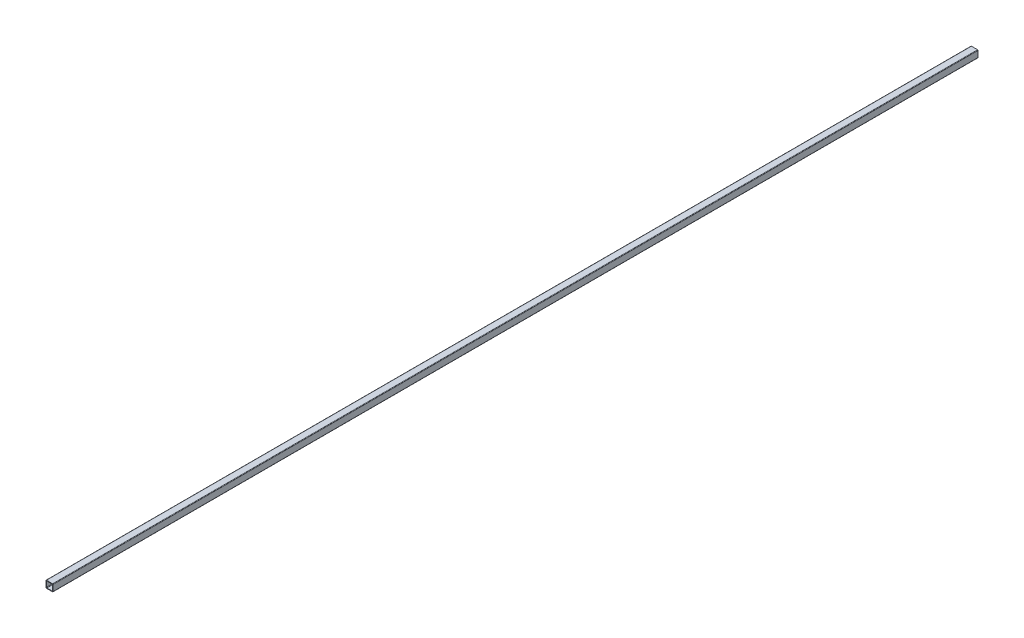
ISO-10303-21;
HEADER;
FILE_DESCRIPTION(('STEP AP214'),'2;1');
FILE_NAME('part.step','',(''),(''),'','','');
FILE_SCHEMA(('AUTOMOTIVE_DESIGN { 1 0 10303 214 1 1 1 1 }'));
ENDSEC;
DATA;
#1=APPLICATION_CONTEXT('core data for automotive mechanical design processes');
#2=APPLICATION_PROTOCOL_DEFINITION('international standard','automotive_design',2000,#1);
#3=PRODUCT_CONTEXT('',#1,'mechanical');
#4=PRODUCT('Part','Part','',(#3));
#5=PRODUCT_RELATED_PRODUCT_CATEGORY('part','',(#4));
#6=PRODUCT_DEFINITION_FORMATION('','',#4);
#7=PRODUCT_DEFINITION_CONTEXT('part definition',#1,'design');
#8=PRODUCT_DEFINITION('design','',#6,#7);
#9=PRODUCT_DEFINITION_SHAPE('','',#8);
#10=(LENGTH_UNIT() NAMED_UNIT(*) SI_UNIT(.MILLI.,.METRE.));
#11=(NAMED_UNIT(*) PLANE_ANGLE_UNIT() SI_UNIT($,.RADIAN.));
#12=(NAMED_UNIT(*) SI_UNIT($,.STERADIAN.) SOLID_ANGLE_UNIT());
#13=UNCERTAINTY_MEASURE_WITH_UNIT(LENGTH_MEASURE(1.E-05),#10,'distance_accuracy_value','');
#14=(GEOMETRIC_REPRESENTATION_CONTEXT(3) GLOBAL_UNCERTAINTY_ASSIGNED_CONTEXT((#13)) GLOBAL_UNIT_ASSIGNED_CONTEXT((#10,
#11,#12)) REPRESENTATION_CONTEXT('',''));
#15=CARTESIAN_POINT('',(0.,0.,0.));
#16=DIRECTION('',(0.,0.,1.));
#17=DIRECTION('',(1.,0.,0.));
#18=AXIS2_PLACEMENT_3D('',#15,#16,#17);
#19=CARTESIAN_POINT('',(2.54,-35.56,5020.));
#20=DIRECTION('',(0.,0.,1.));
#21=DIRECTION('',(1.,0.,0.));
#22=AXIS2_PLACEMENT_3D('',#19,#20,#21);
#23=PLANE('',#22);
#24=CARTESIAN_POINT('',(2.54,-35.56,5020.));
#25=DIRECTION('',(0.,0.,1.));
#26=DIRECTION('',(1.,0.,0.));
#27=AXIS2_PLACEMENT_3D('',#24,#25,#26);
#28=CIRCLE('',#27,2.54);
#29=CARTESIAN_POINT('',(0.,-35.56,5020.));
#30=VERTEX_POINT('',#29);
#31=CARTESIAN_POINT('',(2.54000000000002,-38.1,5020.));
#32=VERTEX_POINT('',#31);
#33=EDGE_CURVE('E212',#30,#32,#28,.T.);
#34=ORIENTED_EDGE('',*,*,#33,.T.);
#35=DIRECTION('',(1.,0.,0.));
#36=VECTOR('',#35,1.);
#37=CARTESIAN_POINT('',(2.54000000000002,-38.1,5020.));
#38=LINE('',#37,#36);
#39=CARTESIAN_POINT('',(35.56,-38.1,5020.));
#40=VERTEX_POINT('',#39);
#41=EDGE_CURVE('E215',#32,#40,#38,.T.);
#42=ORIENTED_EDGE('',*,*,#41,.T.);
#43=CARTESIAN_POINT('',(35.56,-35.56,5020.));
#44=DIRECTION('',(0.,0.,1.));
#45=DIRECTION('',(-1.,0.,0.));
#46=AXIS2_PLACEMENT_3D('',#43,#44,#45);
#47=CIRCLE('',#46,2.54);
#48=CARTESIAN_POINT('',(38.1,-35.56,5020.));
#49=VERTEX_POINT('',#48);
#50=EDGE_CURVE('E218',#40,#49,#47,.T.);
#51=ORIENTED_EDGE('',*,*,#50,.T.);
#52=DIRECTION('',(0.,1.,0.));
#53=VECTOR('',#52,1.);
#54=CARTESIAN_POINT('',(38.1,-2.54000000000002,5020.));
#55=LINE('',#54,#53);
#56=CARTESIAN_POINT('',(38.1,-2.54000000000002,5020.));
#57=VERTEX_POINT('',#56);
#58=EDGE_CURVE('E220',#49,#57,#55,.T.);
#59=ORIENTED_EDGE('',*,*,#58,.T.);
#60=CARTESIAN_POINT('',(35.56,-2.54,5020.));
#61=DIRECTION('',(0.,0.,1.));
#62=DIRECTION('',(1.,0.,0.));
#63=AXIS2_PLACEMENT_3D('',#60,#61,#62);
#64=CIRCLE('',#63,2.54);
#65=CARTESIAN_POINT('',(35.56,0.,5020.));
#66=VERTEX_POINT('',#65);
#67=EDGE_CURVE('E222',#57,#66,#64,.T.);
#68=ORIENTED_EDGE('',*,*,#67,.T.);
#69=DIRECTION('',(-1.,0.,0.));
#70=VECTOR('',#69,1.);
#71=CARTESIAN_POINT('',(2.54000000000002,0.,5020.));
#72=LINE('',#71,#70);
#73=CARTESIAN_POINT('',(2.54000000000002,0.,5020.));
#74=VERTEX_POINT('',#73);
#75=EDGE_CURVE('E224',#66,#74,#72,.T.);
#76=ORIENTED_EDGE('',*,*,#75,.T.);
#77=CARTESIAN_POINT('',(2.54,-2.54,5020.));
#78=DIRECTION('',(0.,0.,1.));
#79=DIRECTION('',(-1.,0.,0.));
#80=AXIS2_PLACEMENT_3D('',#77,#78,#79);
#81=CIRCLE('',#80,2.54);
#82=CARTESIAN_POINT('',(0.,-2.54000000000002,5020.));
#83=VERTEX_POINT('',#82);
#84=EDGE_CURVE('E226',#74,#83,#81,.T.);
#85=ORIENTED_EDGE('',*,*,#84,.T.);
#86=DIRECTION('',(0.,-1.,0.));
#87=VECTOR('',#86,1.);
#88=CARTESIAN_POINT('',(0.,-2.54000000000002,5020.));
#89=LINE('',#88,#87);
#90=EDGE_CURVE('E228',#83,#30,#89,.T.);
#91=ORIENTED_EDGE('',*,*,#90,.T.);
#92=EDGE_LOOP('',(#34,#42,#51,#59,#68,#76,#85,#91));
#93=FACE_BOUND('',#92,.T.);
#94=DIRECTION('',(1.,0.,0.));
#95=VECTOR('',#94,1.);
#96=CARTESIAN_POINT('',(5.30860000000002,-35.3314,5020.));
#97=LINE('',#96,#95);
#98=CARTESIAN_POINT('',(5.30860000000002,-35.3314,5020.));
#99=VERTEX_POINT('',#98);
#100=CARTESIAN_POINT('',(32.7914,-35.3314,5020.));
#101=VERTEX_POINT('',#100);
#102=EDGE_CURVE('E155',#99,#101,#97,.T.);
#103=ORIENTED_EDGE('',*,*,#102,.F.);
#104=CARTESIAN_POINT('',(5.3086,-32.7914,5020.));
#105=DIRECTION('',(0.,0.,1.));
#106=DIRECTION('',(1.,0.,0.));
#107=AXIS2_PLACEMENT_3D('',#104,#105,#106);
#108=CIRCLE('',#107,2.54);
#109=CARTESIAN_POINT('',(2.7686,-32.7914,5020.));
#110=VERTEX_POINT('',#109);
#111=EDGE_CURVE('E147',#110,#99,#108,.T.);
#112=ORIENTED_EDGE('',*,*,#111,.F.);
#113=DIRECTION('',(0.,-1.,0.));
#114=VECTOR('',#113,1.);
#115=CARTESIAN_POINT('',(2.7686,-5.30860000000002,5020.));
#116=LINE('',#115,#114);
#117=CARTESIAN_POINT('',(2.7686,-5.30860000000002,5020.));
#118=VERTEX_POINT('',#117);
#119=EDGE_CURVE('E180',#118,#110,#116,.T.);
#120=ORIENTED_EDGE('',*,*,#119,.F.);
#121=CARTESIAN_POINT('',(5.3086,-5.3086,5020.));
#122=DIRECTION('',(0.,0.,1.));
#123=DIRECTION('',(1.,0.,0.));
#124=AXIS2_PLACEMENT_3D('',#121,#122,#123);
#125=CIRCLE('',#124,2.54);
#126=CARTESIAN_POINT('',(5.30860000000002,-2.7686,5020.));
#127=VERTEX_POINT('',#126);
#128=EDGE_CURVE('E178',#127,#118,#125,.T.);
#129=ORIENTED_EDGE('',*,*,#128,.F.);
#130=DIRECTION('',(-1.,0.,0.));
#131=VECTOR('',#130,1.);
#132=CARTESIAN_POINT('',(5.30860000000002,-2.7686,5020.));
#133=LINE('',#132,#131);
#134=CARTESIAN_POINT('',(32.7914,-2.7686,5020.));
#135=VERTEX_POINT('',#134);
#136=EDGE_CURVE('E176',#135,#127,#133,.T.);
#137=ORIENTED_EDGE('',*,*,#136,.F.);
#138=CARTESIAN_POINT('',(32.7914,-5.3086,5020.));
#139=DIRECTION('',(0.,0.,1.));
#140=DIRECTION('',(1.,0.,0.));
#141=AXIS2_PLACEMENT_3D('',#138,#139,#140);
#142=CIRCLE('',#141,2.54);
#143=CARTESIAN_POINT('',(35.3314,-5.30860000000002,5020.));
#144=VERTEX_POINT('',#143);
#145=EDGE_CURVE('E174',#144,#135,#142,.T.);
#146=ORIENTED_EDGE('',*,*,#145,.F.);
#147=DIRECTION('',(0.,1.,0.));
#148=VECTOR('',#147,1.);
#149=CARTESIAN_POINT('',(35.3314,-5.30860000000002,5020.));
#150=LINE('',#149,#148);
#151=CARTESIAN_POINT('',(35.3314,-32.7914,5020.));
#152=VERTEX_POINT('',#151);
#153=EDGE_CURVE('E170',#152,#144,#150,.T.);
#154=ORIENTED_EDGE('',*,*,#153,.F.);
#155=CARTESIAN_POINT('',(32.7914,-32.7914,5020.));
#156=DIRECTION('',(0.,0.,1.));
#157=DIRECTION('',(1.,0.,0.));
#158=AXIS2_PLACEMENT_3D('',#155,#156,#157);
#159=CIRCLE('',#158,2.54);
#160=EDGE_CURVE('E168',#101,#152,#159,.T.);
#161=ORIENTED_EDGE('',*,*,#160,.F.);
#162=EDGE_LOOP('',(#103,#112,#120,#129,#137,#146,#154,#161));
#163=FACE_BOUND('',#162,.T.);
#164=ADVANCED_FACE('F34',(#93,#163),#23,.T.);
#165=CARTESIAN_POINT('',(2.54,-35.56,0.));
#166=DIRECTION('',(0.,0.,1.));
#167=DIRECTION('',(1.,0.,0.));
#168=AXIS2_PLACEMENT_3D('',#165,#166,#167);
#169=PLANE('',#168);
#170=CARTESIAN_POINT('',(2.54,-35.56,0.));
#171=DIRECTION('',(0.,0.,1.));
#172=DIRECTION('',(1.,0.,0.));
#173=AXIS2_PLACEMENT_3D('',#170,#171,#172);
#174=CIRCLE('',#173,2.54);
#175=CARTESIAN_POINT('',(0.,-35.56,0.));
#176=VERTEX_POINT('',#175);
#177=CARTESIAN_POINT('',(2.54000000000002,-38.1,0.));
#178=VERTEX_POINT('',#177);
#179=EDGE_CURVE('E163',#176,#178,#174,.T.);
#180=ORIENTED_EDGE('',*,*,#179,.F.);
#181=DIRECTION('',(0.,-1.,0.));
#182=VECTOR('',#181,1.);
#183=CARTESIAN_POINT('',(0.,-2.54000000000002,0.));
#184=LINE('',#183,#182);
#185=CARTESIAN_POINT('',(0.,-2.54000000000002,0.));
#186=VERTEX_POINT('',#185);
#187=EDGE_CURVE('E216',#186,#176,#184,.T.);
#188=ORIENTED_EDGE('',*,*,#187,.F.);
#189=CARTESIAN_POINT('',(2.54,-2.54,0.));
#190=DIRECTION('',(0.,0.,1.));
#191=DIRECTION('',(-1.,0.,0.));
#192=AXIS2_PLACEMENT_3D('',#189,#190,#191);
#193=CIRCLE('',#192,2.54);
#194=CARTESIAN_POINT('',(2.54000000000002,0.,0.));
#195=VERTEX_POINT('',#194);
#196=EDGE_CURVE('E243',#195,#186,#193,.T.);
#197=ORIENTED_EDGE('',*,*,#196,.F.);
#198=DIRECTION('',(-1.,0.,0.));
#199=VECTOR('',#198,1.);
#200=CARTESIAN_POINT('',(2.54000000000002,0.,0.));
#201=LINE('',#200,#199);
#202=CARTESIAN_POINT('',(35.56,0.,0.));
#203=VERTEX_POINT('',#202);
#204=EDGE_CURVE('E241',#203,#195,#201,.T.);
#205=ORIENTED_EDGE('',*,*,#204,.F.);
#206=CARTESIAN_POINT('',(35.56,-2.54,0.));
#207=DIRECTION('',(0.,0.,1.));
#208=DIRECTION('',(1.,0.,0.));
#209=AXIS2_PLACEMENT_3D('',#206,#207,#208);
#210=CIRCLE('',#209,2.54);
#211=CARTESIAN_POINT('',(38.1,-2.54000000000002,0.));
#212=VERTEX_POINT('',#211);
#213=EDGE_CURVE('E239',#212,#203,#210,.T.);
#214=ORIENTED_EDGE('',*,*,#213,.F.);
#215=DIRECTION('',(0.,1.,0.));
#216=VECTOR('',#215,1.);
#217=CARTESIAN_POINT('',(38.1,-2.54000000000002,0.));
#218=LINE('',#217,#216);
#219=CARTESIAN_POINT('',(38.1,-35.56,0.));
#220=VERTEX_POINT('',#219);
#221=EDGE_CURVE('E237',#220,#212,#218,.T.);
#222=ORIENTED_EDGE('',*,*,#221,.F.);
#223=CARTESIAN_POINT('',(35.56,-35.56,0.));
#224=DIRECTION('',(0.,0.,1.));
#225=DIRECTION('',(-1.,0.,0.));
#226=AXIS2_PLACEMENT_3D('',#223,#224,#225);
#227=CIRCLE('',#226,2.54);
#228=CARTESIAN_POINT('',(35.56,-38.1,0.));
#229=VERTEX_POINT('',#228);
#230=EDGE_CURVE('E235',#229,#220,#227,.T.);
#231=ORIENTED_EDGE('',*,*,#230,.F.);
#232=DIRECTION('',(1.,0.,0.));
#233=VECTOR('',#232,1.);
#234=CARTESIAN_POINT('',(2.54000000000002,-38.1,0.));
#235=LINE('',#234,#233);
#236=EDGE_CURVE('E233',#178,#229,#235,.T.);
#237=ORIENTED_EDGE('',*,*,#236,.F.);
#238=EDGE_LOOP('',(#180,#188,#197,#205,#214,#222,#231,#237));
#239=FACE_BOUND('',#238,.T.);
#240=CARTESIAN_POINT('',(5.3086,-32.7914,0.));
#241=DIRECTION('',(0.,0.,1.));
#242=DIRECTION('',(1.,0.,0.));
#243=AXIS2_PLACEMENT_3D('',#240,#241,#242);
#244=CIRCLE('',#243,2.54);
#245=CARTESIAN_POINT('',(2.7686,-32.7914,0.));
#246=VERTEX_POINT('',#245);
#247=CARTESIAN_POINT('',(5.30860000000002,-35.3314,0.));
#248=VERTEX_POINT('',#247);
#249=EDGE_CURVE('E57',#246,#248,#244,.T.);
#250=ORIENTED_EDGE('',*,*,#249,.T.);
#251=DIRECTION('',(1.,0.,0.));
#252=VECTOR('',#251,1.);
#253=CARTESIAN_POINT('',(5.30860000000002,-35.3314,0.));
#254=LINE('',#253,#252);
#255=CARTESIAN_POINT('',(32.7914,-35.3314,0.));
#256=VERTEX_POINT('',#255);
#257=EDGE_CURVE('E162',#248,#256,#254,.T.);
#258=ORIENTED_EDGE('',*,*,#257,.T.);
#259=CARTESIAN_POINT('',(32.7914,-32.7914,0.));
#260=DIRECTION('',(0.,0.,1.));
#261=DIRECTION('',(1.,0.,0.));
#262=AXIS2_PLACEMENT_3D('',#259,#260,#261);
#263=CIRCLE('',#262,2.54);
#264=CARTESIAN_POINT('',(35.3314,-32.7914,0.));
#265=VERTEX_POINT('',#264);
#266=EDGE_CURVE('E184',#256,#265,#263,.T.);
#267=ORIENTED_EDGE('',*,*,#266,.T.);
#268=DIRECTION('',(0.,1.,0.));
#269=VECTOR('',#268,1.);
#270=CARTESIAN_POINT('',(35.3314,-5.30860000000002,0.));
#271=LINE('',#270,#269);
#272=CARTESIAN_POINT('',(35.3314,-5.30860000000002,0.));
#273=VERTEX_POINT('',#272);
#274=EDGE_CURVE('E187',#265,#273,#271,.T.);
#275=ORIENTED_EDGE('',*,*,#274,.T.);
#276=CARTESIAN_POINT('',(32.7914,-5.3086,0.));
#277=DIRECTION('',(0.,0.,1.));
#278=DIRECTION('',(1.,0.,0.));
#279=AXIS2_PLACEMENT_3D('',#276,#277,#278);
#280=CIRCLE('',#279,2.54);
#281=CARTESIAN_POINT('',(32.7914,-2.7686,0.));
#282=VERTEX_POINT('',#281);
#283=EDGE_CURVE('E190',#273,#282,#280,.T.);
#284=ORIENTED_EDGE('',*,*,#283,.T.);
#285=DIRECTION('',(-1.,0.,0.));
#286=VECTOR('',#285,1.);
#287=CARTESIAN_POINT('',(5.30860000000002,-2.7686,0.));
#288=LINE('',#287,#286);
#289=CARTESIAN_POINT('',(5.30860000000002,-2.7686,0.));
#290=VERTEX_POINT('',#289);
#291=EDGE_CURVE('E193',#282,#290,#288,.T.);
#292=ORIENTED_EDGE('',*,*,#291,.T.);
#293=CARTESIAN_POINT('',(5.3086,-5.3086,0.));
#294=DIRECTION('',(0.,0.,1.));
#295=DIRECTION('',(1.,0.,0.));
#296=AXIS2_PLACEMENT_3D('',#293,#294,#295);
#297=CIRCLE('',#296,2.54);
#298=CARTESIAN_POINT('',(2.7686,-5.30860000000002,0.));
#299=VERTEX_POINT('',#298);
#300=EDGE_CURVE('E196',#290,#299,#297,.T.);
#301=ORIENTED_EDGE('',*,*,#300,.T.);
#302=DIRECTION('',(0.,-1.,0.));
#303=VECTOR('',#302,1.);
#304=CARTESIAN_POINT('',(2.7686,-5.30860000000002,0.));
#305=LINE('',#304,#303);
#306=EDGE_CURVE('E156',#299,#246,#305,.T.);
#307=ORIENTED_EDGE('',*,*,#306,.T.);
#308=EDGE_LOOP('',(#250,#258,#267,#275,#284,#292,#301,#307));
#309=FACE_BOUND('',#308,.T.);
#310=ADVANCED_FACE('F273',(#239,#309),#169,.F.);
#311=CARTESIAN_POINT('',(2.54,-35.56,5020.));
#312=DIRECTION('',(0.,0.,-1.));
#313=DIRECTION('',(-1.,0.,0.));
#314=AXIS2_PLACEMENT_3D('',#311,#312,#313);
#315=CYLINDRICAL_SURFACE('',#314,2.54);
#316=ORIENTED_EDGE('',*,*,#179,.T.);
#317=DIRECTION('',(0.,0.,-1.));
#318=VECTOR('',#317,1.);
#319=CARTESIAN_POINT('',(2.54000000000002,-38.1,5020.));
#320=LINE('',#319,#318);
#321=EDGE_CURVE('E11',#32,#178,#320,.T.);
#322=ORIENTED_EDGE('',*,*,#321,.F.);
#323=ORIENTED_EDGE('',*,*,#33,.F.);
#324=DIRECTION('',(0.,0.,-1.));
#325=VECTOR('',#324,1.);
#326=CARTESIAN_POINT('',(0.,-35.56,5020.));
#327=LINE('',#326,#325);
#328=EDGE_CURVE('E230',#30,#176,#327,.T.);
#329=ORIENTED_EDGE('',*,*,#328,.T.);
#330=EDGE_LOOP('',(#316,#322,#323,#329));
#331=FACE_BOUND('',#330,.T.);
#332=ADVANCED_FACE('F36',(#331),#315,.T.);
#333=CARTESIAN_POINT('',(2.54000000000002,-38.1,5020.));
#334=DIRECTION('',(0.,1.,0.));
#335=DIRECTION('',(0.,0.,1.));
#336=AXIS2_PLACEMENT_3D('',#333,#334,#335);
#337=PLANE('',#336);
#338=ORIENTED_EDGE('',*,*,#236,.T.);
#339=DIRECTION('',(0.,0.,-1.));
#340=VECTOR('',#339,1.);
#341=CARTESIAN_POINT('',(35.56,-38.1,5020.));
#342=LINE('',#341,#340);
#343=EDGE_CURVE('E42',#40,#229,#342,.T.);
#344=ORIENTED_EDGE('',*,*,#343,.F.);
#345=ORIENTED_EDGE('',*,*,#41,.F.);
#346=ORIENTED_EDGE('',*,*,#321,.T.);
#347=EDGE_LOOP('',(#338,#344,#345,#346));
#348=FACE_BOUND('',#347,.T.);
#349=ADVANCED_FACE('F290',(#348),#337,.F.);
#350=CARTESIAN_POINT('',(35.56,-35.56,5020.));
#351=DIRECTION('',(0.,0.,-1.));
#352=DIRECTION('',(-1.,0.,0.));
#353=AXIS2_PLACEMENT_3D('',#350,#351,#352);
#354=CYLINDRICAL_SURFACE('',#353,2.54);
#355=ORIENTED_EDGE('',*,*,#230,.T.);
#356=DIRECTION('',(0.,0.,-1.));
#357=VECTOR('',#356,1.);
#358=CARTESIAN_POINT('',(38.1,-35.56,5020.));
#359=LINE('',#358,#357);
#360=EDGE_CURVE('E260',#49,#220,#359,.T.);
#361=ORIENTED_EDGE('',*,*,#360,.F.);
#362=ORIENTED_EDGE('',*,*,#50,.F.);
#363=ORIENTED_EDGE('',*,*,#343,.T.);
#364=EDGE_LOOP('',(#355,#361,#362,#363));
#365=FACE_BOUND('',#364,.T.);
#366=ADVANCED_FACE('F267',(#365),#354,.T.);
#367=CARTESIAN_POINT('',(38.1,-2.54000000000002,5020.));
#368=DIRECTION('',(-1.,0.,0.));
#369=DIRECTION('',(0.,-1.,0.));
#370=AXIS2_PLACEMENT_3D('',#367,#368,#369);
#371=PLANE('',#370);
#372=ORIENTED_EDGE('',*,*,#221,.T.);
#373=DIRECTION('',(0.,0.,-1.));
#374=VECTOR('',#373,1.);
#375=CARTESIAN_POINT('',(38.1,-2.54000000000002,5020.));
#376=LINE('',#375,#374);
#377=EDGE_CURVE('E257',#57,#212,#376,.T.);
#378=ORIENTED_EDGE('',*,*,#377,.F.);
#379=ORIENTED_EDGE('',*,*,#58,.F.);
#380=ORIENTED_EDGE('',*,*,#360,.T.);
#381=EDGE_LOOP('',(#372,#378,#379,#380));
#382=FACE_BOUND('',#381,.T.);
#383=ADVANCED_FACE('F279',(#382),#371,.F.);
#384=CARTESIAN_POINT('',(35.56,-2.54,5020.));
#385=DIRECTION('',(0.,0.,-1.));
#386=DIRECTION('',(-1.,0.,0.));
#387=AXIS2_PLACEMENT_3D('',#384,#385,#386);
#388=CYLINDRICAL_SURFACE('',#387,2.54);
#389=ORIENTED_EDGE('',*,*,#213,.T.);
#390=DIRECTION('',(0.,0.,-1.));
#391=VECTOR('',#390,1.);
#392=CARTESIAN_POINT('',(35.56,0.,5020.));
#393=LINE('',#392,#391);
#394=EDGE_CURVE('E254',#66,#203,#393,.T.);
#395=ORIENTED_EDGE('',*,*,#394,.F.);
#396=ORIENTED_EDGE('',*,*,#67,.F.);
#397=ORIENTED_EDGE('',*,*,#377,.T.);
#398=EDGE_LOOP('',(#389,#395,#396,#397));
#399=FACE_BOUND('',#398,.T.);
#400=ADVANCED_FACE('F283',(#399),#388,.T.);
#401=CARTESIAN_POINT('',(2.54000000000002,0.,5020.));
#402=DIRECTION('',(0.,-1.,0.));
#403=DIRECTION('',(0.,0.,-1.));
#404=AXIS2_PLACEMENT_3D('',#401,#402,#403);
#405=PLANE('',#404);
#406=ORIENTED_EDGE('',*,*,#204,.T.);
#407=DIRECTION('',(0.,0.,-1.));
#408=VECTOR('',#407,1.);
#409=CARTESIAN_POINT('',(2.54000000000002,0.,5020.));
#410=LINE('',#409,#408);
#411=EDGE_CURVE('E251',#74,#195,#410,.T.);
#412=ORIENTED_EDGE('',*,*,#411,.F.);
#413=ORIENTED_EDGE('',*,*,#75,.F.);
#414=ORIENTED_EDGE('',*,*,#394,.T.);
#415=EDGE_LOOP('',(#406,#412,#413,#414));
#416=FACE_BOUND('',#415,.T.);
#417=ADVANCED_FACE('F303',(#416),#405,.F.);
#418=CARTESIAN_POINT('',(2.54,-2.54,5020.));
#419=DIRECTION('',(0.,0.,-1.));
#420=DIRECTION('',(-1.,0.,0.));
#421=AXIS2_PLACEMENT_3D('',#418,#419,#420);
#422=CYLINDRICAL_SURFACE('',#421,2.54);
#423=ORIENTED_EDGE('',*,*,#196,.T.);
#424=DIRECTION('',(0.,0.,-1.));
#425=VECTOR('',#424,1.);
#426=CARTESIAN_POINT('',(0.,-2.54000000000002,5020.));
#427=LINE('',#426,#425);
#428=EDGE_CURVE('E248',#83,#186,#427,.T.);
#429=ORIENTED_EDGE('',*,*,#428,.F.);
#430=ORIENTED_EDGE('',*,*,#84,.F.);
#431=ORIENTED_EDGE('',*,*,#411,.T.);
#432=EDGE_LOOP('',(#423,#429,#430,#431));
#433=FACE_BOUND('',#432,.T.);
#434=ADVANCED_FACE('F301',(#433),#422,.T.);
#435=CARTESIAN_POINT('',(0.,-2.54000000000002,5020.));
#436=DIRECTION('',(1.,0.,0.));
#437=DIRECTION('',(0.,1.,0.));
#438=AXIS2_PLACEMENT_3D('',#435,#436,#437);
#439=PLANE('',#438);
#440=ORIENTED_EDGE('',*,*,#187,.T.);
#441=ORIENTED_EDGE('',*,*,#328,.F.);
#442=ORIENTED_EDGE('',*,*,#90,.F.);
#443=ORIENTED_EDGE('',*,*,#428,.T.);
#444=EDGE_LOOP('',(#440,#441,#442,#443));
#445=FACE_BOUND('',#444,.T.);
#446=ADVANCED_FACE('F296',(#445),#439,.F.);
#447=CARTESIAN_POINT('',(5.3086,-32.7914,5020.));
#448=DIRECTION('',(0.,0.,-1.));
#449=DIRECTION('',(-1.,0.,0.));
#450=AXIS2_PLACEMENT_3D('',#447,#448,#449);
#451=CYLINDRICAL_SURFACE('',#450,2.54);
#452=ORIENTED_EDGE('',*,*,#249,.F.);
#453=DIRECTION('',(0.,0.,-1.));
#454=VECTOR('',#453,1.);
#455=CARTESIAN_POINT('',(2.7686,-32.7914,5020.));
#456=LINE('',#455,#454);
#457=EDGE_CURVE('E151',#110,#246,#456,.T.);
#458=ORIENTED_EDGE('',*,*,#457,.F.);
#459=ORIENTED_EDGE('',*,*,#111,.T.);
#460=DIRECTION('',(0.,0.,-1.));
#461=VECTOR('',#460,1.);
#462=CARTESIAN_POINT('',(5.30860000000002,-35.3314,5020.));
#463=LINE('',#462,#461);
#464=EDGE_CURVE('E150',#99,#248,#463,.T.);
#465=ORIENTED_EDGE('',*,*,#464,.T.);
#466=EDGE_LOOP('',(#452,#458,#459,#465));
#467=FACE_BOUND('',#466,.T.);
#468=ADVANCED_FACE('F149',(#467),#451,.F.);
#469=CARTESIAN_POINT('',(5.30860000000002,-35.3314,5020.));
#470=DIRECTION('',(0.,1.,0.));
#471=DIRECTION('',(0.,0.,1.));
#472=AXIS2_PLACEMENT_3D('',#469,#470,#471);
#473=PLANE('',#472);
#474=ORIENTED_EDGE('',*,*,#257,.F.);
#475=ORIENTED_EDGE('',*,*,#464,.F.);
#476=ORIENTED_EDGE('',*,*,#102,.T.);
#477=DIRECTION('',(0.,0.,-1.));
#478=VECTOR('',#477,1.);
#479=CARTESIAN_POINT('',(32.7914,-35.3314,5020.));
#480=LINE('',#479,#478);
#481=EDGE_CURVE('E164',#101,#256,#480,.T.);
#482=ORIENTED_EDGE('',*,*,#481,.T.);
#483=EDGE_LOOP('',(#474,#475,#476,#482));
#484=FACE_BOUND('',#483,.T.);
#485=ADVANCED_FACE('F159',(#484),#473,.T.);
#486=CARTESIAN_POINT('',(32.7914,-32.7914,5020.));
#487=DIRECTION('',(0.,0.,-1.));
#488=DIRECTION('',(-1.,0.,0.));
#489=AXIS2_PLACEMENT_3D('',#486,#487,#488);
#490=CYLINDRICAL_SURFACE('',#489,2.54);
#491=ORIENTED_EDGE('',*,*,#266,.F.);
#492=ORIENTED_EDGE('',*,*,#481,.F.);
#493=ORIENTED_EDGE('',*,*,#160,.T.);
#494=DIRECTION('',(0.,0.,-1.));
#495=VECTOR('',#494,1.);
#496=CARTESIAN_POINT('',(35.3314,-32.7914,5020.));
#497=LINE('',#496,#495);
#498=EDGE_CURVE('E209',#152,#265,#497,.T.);
#499=ORIENTED_EDGE('',*,*,#498,.T.);
#500=EDGE_LOOP('',(#491,#492,#493,#499));
#501=FACE_BOUND('',#500,.T.);
#502=ADVANCED_FACE('F328',(#501),#490,.F.);
#503=CARTESIAN_POINT('',(35.3314,-5.30860000000002,5020.));
#504=DIRECTION('',(-1.,0.,0.));
#505=DIRECTION('',(0.,0.,1.));
#506=AXIS2_PLACEMENT_3D('',#503,#504,#505);
#507=PLANE('',#506);
#508=ORIENTED_EDGE('',*,*,#274,.F.);
#509=ORIENTED_EDGE('',*,*,#498,.F.);
#510=ORIENTED_EDGE('',*,*,#153,.T.);
#511=DIRECTION('',(0.,0.,-1.));
#512=VECTOR('',#511,1.);
#513=CARTESIAN_POINT('',(35.3314,-5.30860000000002,5020.));
#514=LINE('',#513,#512);
#515=EDGE_CURVE('E207',#144,#273,#514,.T.);
#516=ORIENTED_EDGE('',*,*,#515,.T.);
#517=EDGE_LOOP('',(#508,#509,#510,#516));
#518=FACE_BOUND('',#517,.T.);
#519=ADVANCED_FACE('F332',(#518),#507,.T.);
#520=CARTESIAN_POINT('',(32.7914,-5.3086,5020.));
#521=DIRECTION('',(0.,0.,-1.));
#522=DIRECTION('',(-1.,0.,0.));
#523=AXIS2_PLACEMENT_3D('',#520,#521,#522);
#524=CYLINDRICAL_SURFACE('',#523,2.54);
#525=ORIENTED_EDGE('',*,*,#283,.F.);
#526=ORIENTED_EDGE('',*,*,#515,.F.);
#527=ORIENTED_EDGE('',*,*,#145,.T.);
#528=DIRECTION('',(0.,0.,-1.));
#529=VECTOR('',#528,1.);
#530=CARTESIAN_POINT('',(32.7914,-2.7686,5020.));
#531=LINE('',#530,#529);
#532=EDGE_CURVE('E205',#135,#282,#531,.T.);
#533=ORIENTED_EDGE('',*,*,#532,.T.);
#534=EDGE_LOOP('',(#525,#526,#527,#533));
#535=FACE_BOUND('',#534,.T.);
#536=ADVANCED_FACE('F338',(#535),#524,.F.);
#537=CARTESIAN_POINT('',(5.30860000000002,-2.7686,5020.));
#538=DIRECTION('',(0.,-1.,0.));
#539=DIRECTION('',(0.,0.,-1.));
#540=AXIS2_PLACEMENT_3D('',#537,#538,#539);
#541=PLANE('',#540);
#542=ORIENTED_EDGE('',*,*,#291,.F.);
#543=ORIENTED_EDGE('',*,*,#532,.F.);
#544=ORIENTED_EDGE('',*,*,#136,.T.);
#545=DIRECTION('',(0.,0.,-1.));
#546=VECTOR('',#545,1.);
#547=CARTESIAN_POINT('',(5.30860000000002,-2.7686,5020.));
#548=LINE('',#547,#546);
#549=EDGE_CURVE('E203',#127,#290,#548,.T.);
#550=ORIENTED_EDGE('',*,*,#549,.T.);
#551=EDGE_LOOP('',(#542,#543,#544,#550));
#552=FACE_BOUND('',#551,.T.);
#553=ADVANCED_FACE('F342',(#552),#541,.T.);
#554=CARTESIAN_POINT('',(5.3086,-5.3086,5020.));
#555=DIRECTION('',(0.,0.,-1.));
#556=DIRECTION('',(-1.,0.,0.));
#557=AXIS2_PLACEMENT_3D('',#554,#555,#556);
#558=CYLINDRICAL_SURFACE('',#557,2.54);
#559=ORIENTED_EDGE('',*,*,#300,.F.);
#560=ORIENTED_EDGE('',*,*,#549,.F.);
#561=ORIENTED_EDGE('',*,*,#128,.T.);
#562=DIRECTION('',(0.,0.,-1.));
#563=VECTOR('',#562,1.);
#564=CARTESIAN_POINT('',(2.7686,-5.30860000000002,5020.));
#565=LINE('',#564,#563);
#566=EDGE_CURVE('E49',#118,#299,#565,.T.);
#567=ORIENTED_EDGE('',*,*,#566,.T.);
#568=EDGE_LOOP('',(#559,#560,#561,#567));
#569=FACE_BOUND('',#568,.T.);
#570=ADVANCED_FACE('F346',(#569),#558,.F.);
#571=CARTESIAN_POINT('',(2.7686,-5.30860000000002,5020.));
#572=DIRECTION('',(1.,0.,0.));
#573=DIRECTION('',(0.,0.,-1.));
#574=AXIS2_PLACEMENT_3D('',#571,#572,#573);
#575=PLANE('',#574);
#576=ORIENTED_EDGE('',*,*,#306,.F.);
#577=ORIENTED_EDGE('',*,*,#566,.F.);
#578=ORIENTED_EDGE('',*,*,#119,.T.);
#579=ORIENTED_EDGE('',*,*,#457,.T.);
#580=EDGE_LOOP('',(#576,#577,#578,#579));
#581=FACE_BOUND('',#580,.T.);
#582=ADVANCED_FACE('F350',(#581),#575,.T.);
#583=CLOSED_SHELL('',(#164,#310,#332,#349,#366,#383,#400,#417,#434,#446,#468,#485,#502,#519,
#536,#553,#570,#582));
#584=MANIFOLD_SOLID_BREP('B2',#583);
#585=ADVANCED_BREP_SHAPE_REPRESENTATION('',(#18,#584),#14);
#586=SHAPE_DEFINITION_REPRESENTATION(#9,#585);
ENDSEC;
END-ISO-10303-21;
